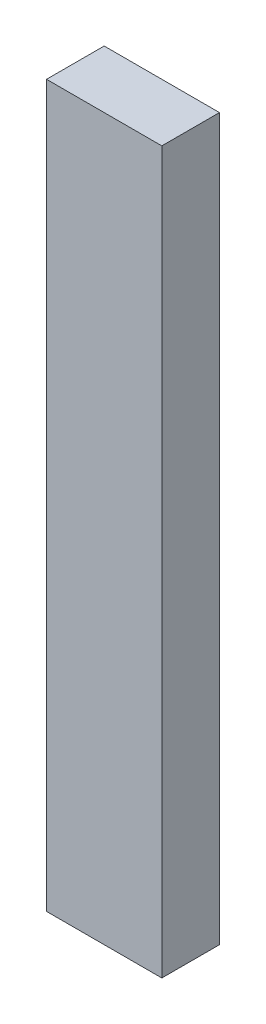
ISO-10303-21;
HEADER;
FILE_DESCRIPTION(('STEP AP214'),'2;1');
FILE_NAME('part.step','',(''),(''),'','','');
FILE_SCHEMA(('AUTOMOTIVE_DESIGN { 1 0 10303 214 1 1 1 1 }'));
ENDSEC;
DATA;
#1=APPLICATION_CONTEXT('core data for automotive mechanical design processes');
#2=APPLICATION_PROTOCOL_DEFINITION('international standard','automotive_design',2000,#1);
#3=PRODUCT_CONTEXT('',#1,'mechanical');
#4=PRODUCT('Part','Part','',(#3));
#5=PRODUCT_RELATED_PRODUCT_CATEGORY('part','',(#4));
#6=PRODUCT_DEFINITION_FORMATION('','',#4);
#7=PRODUCT_DEFINITION_CONTEXT('part definition',#1,'design');
#8=PRODUCT_DEFINITION('design','',#6,#7);
#9=PRODUCT_DEFINITION_SHAPE('','',#8);
#10=(LENGTH_UNIT() NAMED_UNIT(*) SI_UNIT(.MILLI.,.METRE.));
#11=(NAMED_UNIT(*) PLANE_ANGLE_UNIT() SI_UNIT($,.RADIAN.));
#12=(NAMED_UNIT(*) SI_UNIT($,.STERADIAN.) SOLID_ANGLE_UNIT());
#13=UNCERTAINTY_MEASURE_WITH_UNIT(LENGTH_MEASURE(1.E-05),#10,'distance_accuracy_value','');
#14=(GEOMETRIC_REPRESENTATION_CONTEXT(3) GLOBAL_UNCERTAINTY_ASSIGNED_CONTEXT((#13)) GLOBAL_UNIT_ASSIGNED_CONTEXT((#10,
#11,#12)) REPRESENTATION_CONTEXT('',''));
#15=CARTESIAN_POINT('',(0.,0.,0.));
#16=DIRECTION('',(0.,0.,1.));
#17=DIRECTION('',(1.,0.,0.));
#18=AXIS2_PLACEMENT_3D('',#15,#16,#17);
#19=CARTESIAN_POINT('',(0.,250.,0.));
#20=DIRECTION('',(1.,0.,0.));
#21=DIRECTION('',(0.,0.,-1.));
#22=AXIS2_PLACEMENT_3D('',#19,#20,#21);
#23=PLANE('',#22);
#24=DIRECTION('',(0.,0.,1.));
#25=VECTOR('',#24,1.);
#26=CARTESIAN_POINT('',(0.,0.,0.));
#27=LINE('',#26,#25);
#28=CARTESIAN_POINT('',(0.,0.,-20.));
#29=VERTEX_POINT('',#28);
#30=CARTESIAN_POINT('',(0.,0.,0.));
#31=VERTEX_POINT('',#30);
#32=EDGE_CURVE('E98',#29,#31,#27,.T.);
#33=ORIENTED_EDGE('',*,*,#32,.T.);
#34=DIRECTION('',(0.,-1.,0.));
#35=VECTOR('',#34,1.);
#36=CARTESIAN_POINT('',(0.,250.,0.));
#37=LINE('',#36,#35);
#38=CARTESIAN_POINT('',(0.,250.,0.));
#39=VERTEX_POINT('',#38);
#40=EDGE_CURVE('E11',#39,#31,#37,.T.);
#41=ORIENTED_EDGE('',*,*,#40,.F.);
#42=DIRECTION('',(0.,0.,1.));
#43=VECTOR('',#42,1.);
#44=CARTESIAN_POINT('',(0.,250.,0.));
#45=LINE('',#44,#43);
#46=CARTESIAN_POINT('',(0.,250.,-20.));
#47=VERTEX_POINT('',#46);
#48=EDGE_CURVE('E86',#47,#39,#45,.T.);
#49=ORIENTED_EDGE('',*,*,#48,.F.);
#50=DIRECTION('',(0.,-1.,0.));
#51=VECTOR('',#50,1.);
#52=CARTESIAN_POINT('',(0.,250.,-20.));
#53=LINE('',#52,#51);
#54=EDGE_CURVE('E94',#47,#29,#53,.T.);
#55=ORIENTED_EDGE('',*,*,#54,.T.);
#56=EDGE_LOOP('',(#33,#41,#49,#55));
#57=FACE_BOUND('',#56,.T.);
#58=ADVANCED_FACE('F35',(#57),#23,.F.);
#59=CARTESIAN_POINT('',(0.,250.,0.));
#60=DIRECTION('',(0.,0.,-1.));
#61=DIRECTION('',(-1.,0.,0.));
#62=AXIS2_PLACEMENT_3D('',#59,#60,#61);
#63=PLANE('',#62);
#64=DIRECTION('',(1.,0.,0.));
#65=VECTOR('',#64,1.);
#66=CARTESIAN_POINT('',(0.,0.,0.));
#67=LINE('',#66,#65);
#68=CARTESIAN_POINT('',(40.,0.,0.));
#69=VERTEX_POINT('',#68);
#70=EDGE_CURVE('E90',#31,#69,#67,.T.);
#71=ORIENTED_EDGE('',*,*,#70,.T.);
#72=DIRECTION('',(0.,-1.,0.));
#73=VECTOR('',#72,1.);
#74=CARTESIAN_POINT('',(40.,250.,0.));
#75=LINE('',#74,#73);
#76=CARTESIAN_POINT('',(40.,250.,0.));
#77=VERTEX_POINT('',#76);
#78=EDGE_CURVE('E43',#77,#69,#75,.T.);
#79=ORIENTED_EDGE('',*,*,#78,.F.);
#80=DIRECTION('',(1.,0.,0.));
#81=VECTOR('',#80,1.);
#82=CARTESIAN_POINT('',(0.,250.,0.));
#83=LINE('',#82,#81);
#84=EDGE_CURVE('E81',#39,#77,#83,.T.);
#85=ORIENTED_EDGE('',*,*,#84,.F.);
#86=ORIENTED_EDGE('',*,*,#40,.T.);
#87=EDGE_LOOP('',(#71,#79,#85,#86));
#88=FACE_BOUND('',#87,.T.);
#89=ADVANCED_FACE('F89',(#88),#63,.F.);
#90=CARTESIAN_POINT('',(40.,250.,0.));
#91=DIRECTION('',(-1.,0.,0.));
#92=DIRECTION('',(0.,0.,1.));
#93=AXIS2_PLACEMENT_3D('',#90,#91,#92);
#94=PLANE('',#93);
#95=DIRECTION('',(0.,0.,-1.));
#96=VECTOR('',#95,1.);
#97=CARTESIAN_POINT('',(40.,0.,0.));
#98=LINE('',#97,#96);
#99=CARTESIAN_POINT('',(40.,0.,-20.));
#100=VERTEX_POINT('',#99);
#101=EDGE_CURVE('E68',#69,#100,#98,.T.);
#102=ORIENTED_EDGE('',*,*,#101,.T.);
#103=DIRECTION('',(0.,-1.,0.));
#104=VECTOR('',#103,1.);
#105=CARTESIAN_POINT('',(40.,250.,-20.));
#106=LINE('',#105,#104);
#107=CARTESIAN_POINT('',(40.,250.,-20.));
#108=VERTEX_POINT('',#107);
#109=EDGE_CURVE('E91',#108,#100,#106,.T.);
#110=ORIENTED_EDGE('',*,*,#109,.F.);
#111=DIRECTION('',(0.,0.,-1.));
#112=VECTOR('',#111,1.);
#113=CARTESIAN_POINT('',(40.,250.,0.));
#114=LINE('',#113,#112);
#115=EDGE_CURVE('E84',#77,#108,#114,.T.);
#116=ORIENTED_EDGE('',*,*,#115,.F.);
#117=ORIENTED_EDGE('',*,*,#78,.T.);
#118=EDGE_LOOP('',(#102,#110,#116,#117));
#119=FACE_BOUND('',#118,.T.);
#120=ADVANCED_FACE('F92',(#119),#94,.F.);
#121=CARTESIAN_POINT('',(0.,250.,-20.));
#122=DIRECTION('',(0.,0.,1.));
#123=DIRECTION('',(1.,0.,0.));
#124=AXIS2_PLACEMENT_3D('',#121,#122,#123);
#125=PLANE('',#124);
#126=DIRECTION('',(-1.,0.,0.));
#127=VECTOR('',#126,1.);
#128=CARTESIAN_POINT('',(0.,0.,-20.));
#129=LINE('',#128,#127);
#130=EDGE_CURVE('E74',#100,#29,#129,.T.);
#131=ORIENTED_EDGE('',*,*,#130,.T.);
#132=ORIENTED_EDGE('',*,*,#54,.F.);
#133=DIRECTION('',(-1.,0.,0.));
#134=VECTOR('',#133,1.);
#135=CARTESIAN_POINT('',(0.,250.,-20.));
#136=LINE('',#135,#134);
#137=EDGE_CURVE('E51',#108,#47,#136,.T.);
#138=ORIENTED_EDGE('',*,*,#137,.F.);
#139=ORIENTED_EDGE('',*,*,#109,.T.);
#140=EDGE_LOOP('',(#131,#132,#138,#139));
#141=FACE_BOUND('',#140,.T.);
#142=ADVANCED_FACE('F105',(#141),#125,.F.);
#143=CARTESIAN_POINT('',(0.,250.,0.));
#144=DIRECTION('',(0.,-1.,0.));
#145=DIRECTION('',(0.,0.,-1.));
#146=AXIS2_PLACEMENT_3D('',#143,#144,#145);
#147=PLANE('',#146);
#148=ORIENTED_EDGE('',*,*,#48,.T.);
#149=ORIENTED_EDGE('',*,*,#84,.T.);
#150=ORIENTED_EDGE('',*,*,#115,.T.);
#151=ORIENTED_EDGE('',*,*,#137,.T.);
#152=EDGE_LOOP('',(#148,#149,#150,#151));
#153=FACE_BOUND('',#152,.T.);
#154=ADVANCED_FACE('F82',(#153),#147,.F.);
#155=CARTESIAN_POINT('',(0.,0.,0.));
#156=DIRECTION('',(0.,-1.,0.));
#157=DIRECTION('',(0.,0.,-1.));
#158=AXIS2_PLACEMENT_3D('',#155,#156,#157);
#159=PLANE('',#158);
#160=ORIENTED_EDGE('',*,*,#32,.F.);
#161=ORIENTED_EDGE('',*,*,#130,.F.);
#162=ORIENTED_EDGE('',*,*,#101,.F.);
#163=ORIENTED_EDGE('',*,*,#70,.F.);
#164=EDGE_LOOP('',(#160,#161,#162,#163));
#165=FACE_BOUND('',#164,.T.);
#166=ADVANCED_FACE('F108',(#165),#159,.T.);
#167=CLOSED_SHELL('',(#58,#89,#120,#142,#154,#166));
#168=MANIFOLD_SOLID_BREP('B2',#167);
#169=ADVANCED_BREP_SHAPE_REPRESENTATION('',(#18,#168),#14);
#170=SHAPE_DEFINITION_REPRESENTATION(#9,#169);
ENDSEC;
END-ISO-10303-21;
